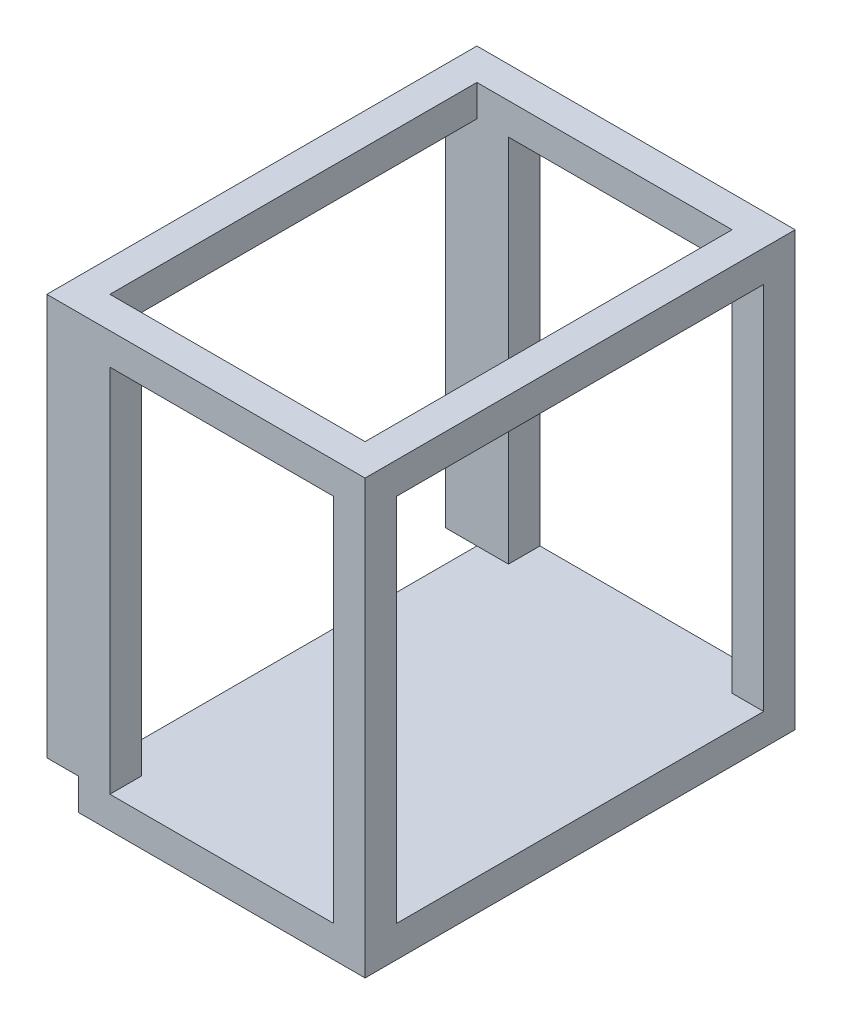
ISO-10303-21;
HEADER;
FILE_DESCRIPTION(('STEP AP214'),'2;1');
FILE_NAME('part.step','',(''),(''),'','','');
FILE_SCHEMA(('AUTOMOTIVE_DESIGN { 1 0 10303 214 1 1 1 1 }'));
ENDSEC;
DATA;
#1=APPLICATION_CONTEXT('core data for automotive mechanical design processes');
#2=APPLICATION_PROTOCOL_DEFINITION('international standard','automotive_design',2000,#1);
#3=PRODUCT_CONTEXT('',#1,'mechanical');
#4=PRODUCT('Part','Part','',(#3));
#5=PRODUCT_RELATED_PRODUCT_CATEGORY('part','',(#4));
#6=PRODUCT_DEFINITION_FORMATION('','',#4);
#7=PRODUCT_DEFINITION_CONTEXT('part definition',#1,'design');
#8=PRODUCT_DEFINITION('design','',#6,#7);
#9=PRODUCT_DEFINITION_SHAPE('','',#8);
#10=(LENGTH_UNIT() NAMED_UNIT(*) SI_UNIT(.MILLI.,.METRE.));
#11=(NAMED_UNIT(*) PLANE_ANGLE_UNIT() SI_UNIT($,.RADIAN.));
#12=(NAMED_UNIT(*) SI_UNIT($,.STERADIAN.) SOLID_ANGLE_UNIT());
#13=UNCERTAINTY_MEASURE_WITH_UNIT(LENGTH_MEASURE(1.E-05),#10,'distance_accuracy_value','');
#14=(GEOMETRIC_REPRESENTATION_CONTEXT(3) GLOBAL_UNCERTAINTY_ASSIGNED_CONTEXT((#13)) GLOBAL_UNIT_ASSIGNED_CONTEXT((#10,
#11,#12)) REPRESENTATION_CONTEXT('',''));
#15=CARTESIAN_POINT('',(0.,0.,0.));
#16=DIRECTION('',(0.,0.,1.));
#17=DIRECTION('',(1.,0.,0.));
#18=AXIS2_PLACEMENT_3D('',#15,#16,#17);
#19=CARTESIAN_POINT('',(-100.,-0.01,-150.01));
#20=DIRECTION('',(-1.,0.,0.));
#21=DIRECTION('',(0.,0.,1.));
#22=AXIS2_PLACEMENT_3D('',#19,#20,#21);
#23=PLANE('',#22);
#24=DIRECTION('',(0.,0.,1.));
#25=VECTOR('',#24,1.);
#26=CARTESIAN_POINT('',(-99.9999999999999,22.,-139.));
#27=LINE('',#26,#25);
#28=CARTESIAN_POINT('',(-100.,22.,-150.));
#29=VERTEX_POINT('',#28);
#30=CARTESIAN_POINT('',(-100.,22.,-128.));
#31=VERTEX_POINT('',#30);
#32=EDGE_CURVE('E163',#29,#31,#27,.T.);
#33=ORIENTED_EDGE('',*,*,#32,.F.);
#34=DIRECTION('',(0.,1.,0.));
#35=VECTOR('',#34,1.);
#36=CARTESIAN_POINT('',(-100.,151.,-150.));
#37=LINE('',#36,#35);
#38=CARTESIAN_POINT('',(-100.,0.,-150.));
#39=VERTEX_POINT('',#38);
#40=EDGE_CURVE('E189',#39,#29,#37,.T.);
#41=ORIENTED_EDGE('',*,*,#40,.F.);
#42=DIRECTION('',(0.,0.,-1.));
#43=VECTOR('',#42,1.);
#44=CARTESIAN_POINT('',(-100.,0.,0.));
#45=LINE('',#44,#43);
#46=CARTESIAN_POINT('',(-100.,0.,150.));
#47=VERTEX_POINT('',#46);
#48=EDGE_CURVE('E229',#47,#39,#45,.T.);
#49=ORIENTED_EDGE('',*,*,#48,.F.);
#50=DIRECTION('',(0.,-1.,0.));
#51=VECTOR('',#50,1.);
#52=CARTESIAN_POINT('',(-100.,151.,150.));
#53=LINE('',#52,#51);
#54=CARTESIAN_POINT('',(-100.,22.,150.));
#55=VERTEX_POINT('',#54);
#56=EDGE_CURVE('E227',#55,#47,#53,.T.);
#57=ORIENTED_EDGE('',*,*,#56,.F.);
#58=DIRECTION('',(0.,0.,1.));
#59=VECTOR('',#58,1.);
#60=CARTESIAN_POINT('',(-100.,22.,139.));
#61=LINE('',#60,#59);
#62=CARTESIAN_POINT('',(-100.,22.,128.));
#63=VERTEX_POINT('',#62);
#64=EDGE_CURVE('E21',#63,#55,#61,.T.);
#65=ORIENTED_EDGE('',*,*,#64,.F.);
#66=DIRECTION('',(0.,0.,1.));
#67=VECTOR('',#66,1.);
#68=CARTESIAN_POINT('',(-100.,22.,0.));
#69=LINE('',#68,#67);
#70=EDGE_CURVE('E273',#31,#63,#69,.T.);
#71=ORIENTED_EDGE('',*,*,#70,.F.);
#72=EDGE_LOOP('',(#33,#41,#49,#57,#65,#71));
#73=FACE_BOUND('',#72,.T.);
#74=ADVANCED_FACE('F17',(#73),#23,.T.);
#75=CARTESIAN_POINT('',(-122.01,22.,150.01));
#76=DIRECTION('',(0.,-1.,0.));
#77=DIRECTION('',(0.,0.,-1.));
#78=AXIS2_PLACEMENT_3D('',#75,#76,#77);
#79=PLANE('',#78);
#80=DIRECTION('',(0.,0.,1.));
#81=VECTOR('',#80,1.);
#82=CARTESIAN_POINT('',(-122.,22.,0.));
#83=LINE('',#82,#81);
#84=CARTESIAN_POINT('',(-122.,22.,128.));
#85=VERTEX_POINT('',#84);
#86=CARTESIAN_POINT('',(-122.,22.,150.));
#87=VERTEX_POINT('',#86);
#88=EDGE_CURVE('E202',#85,#87,#83,.T.);
#89=ORIENTED_EDGE('',*,*,#88,.F.);
#90=DIRECTION('',(-1.,0.,0.));
#91=VECTOR('',#90,1.);
#92=CARTESIAN_POINT('',(-22.,22.,128.));
#93=LINE('',#92,#91);
#94=EDGE_CURVE('E223',#63,#85,#93,.T.);
#95=ORIENTED_EDGE('',*,*,#94,.F.);
#96=ORIENTED_EDGE('',*,*,#64,.T.);
#97=DIRECTION('',(1.,0.,0.));
#98=VECTOR('',#97,1.);
#99=CARTESIAN_POINT('',(-11.,22.,150.));
#100=LINE('',#99,#98);
#101=EDGE_CURVE('E220',#87,#55,#100,.T.);
#102=ORIENTED_EDGE('',*,*,#101,.F.);
#103=EDGE_LOOP('',(#89,#95,#96,#102));
#104=FACE_BOUND('',#103,.T.);
#105=ADVANCED_FACE('F218',(#104),#79,.T.);
#106=CARTESIAN_POINT('',(-78.01,280.,150.01));
#107=DIRECTION('',(0.,-1.,0.));
#108=DIRECTION('',(0.,0.,-1.));
#109=AXIS2_PLACEMENT_3D('',#106,#107,#108);
#110=PLANE('',#109);
#111=DIRECTION('',(0.,0.,-1.));
#112=VECTOR('',#111,1.);
#113=CARTESIAN_POINT('',(78.,280.,139.));
#114=LINE('',#113,#112);
#115=CARTESIAN_POINT('',(78.,280.,150.));
#116=VERTEX_POINT('',#115);
#117=CARTESIAN_POINT('',(78.,280.,128.));
#118=VERTEX_POINT('',#117);
#119=EDGE_CURVE('E294',#116,#118,#114,.T.);
#120=ORIENTED_EDGE('',*,*,#119,.F.);
#121=DIRECTION('',(1.,0.,0.));
#122=VECTOR('',#121,1.);
#123=CARTESIAN_POINT('',(-11.,280.,150.));
#124=LINE('',#123,#122);
#125=CARTESIAN_POINT('',(-78.,280.,150.));
#126=VERTEX_POINT('',#125);
#127=EDGE_CURVE('E232',#126,#116,#124,.T.);
#128=ORIENTED_EDGE('',*,*,#127,.F.);
#129=DIRECTION('',(0.,0.,1.));
#130=VECTOR('',#129,1.);
#131=CARTESIAN_POINT('',(-78.,280.,139.));
#132=LINE('',#131,#130);
#133=CARTESIAN_POINT('',(-78.,280.,128.));
#134=VERTEX_POINT('',#133);
#135=EDGE_CURVE('E209',#134,#126,#132,.T.);
#136=ORIENTED_EDGE('',*,*,#135,.F.);
#137=DIRECTION('',(-1.,0.,0.));
#138=VECTOR('',#137,1.);
#139=CARTESIAN_POINT('',(-22.,280.,128.));
#140=LINE('',#139,#138);
#141=EDGE_CURVE('E36',#118,#134,#140,.T.);
#142=ORIENTED_EDGE('',*,*,#141,.F.);
#143=EDGE_LOOP('',(#120,#128,#136,#142));
#144=FACE_BOUND('',#143,.T.);
#145=ADVANCED_FACE('F295',(#144),#110,.T.);
#146=CARTESIAN_POINT('',(-78.,21.99,150.01));
#147=DIRECTION('',(1.,0.,0.));
#148=DIRECTION('',(0.,0.,-1.));
#149=AXIS2_PLACEMENT_3D('',#146,#147,#148);
#150=PLANE('',#149);
#151=ORIENTED_EDGE('',*,*,#135,.T.);
#152=DIRECTION('',(0.,1.,0.));
#153=VECTOR('',#152,1.);
#154=CARTESIAN_POINT('',(-78.,151.,150.));
#155=LINE('',#154,#153);
#156=CARTESIAN_POINT('',(-78.,22.,150.));
#157=VERTEX_POINT('',#156);
#158=EDGE_CURVE('E287',#157,#126,#155,.T.);
#159=ORIENTED_EDGE('',*,*,#158,.F.);
#160=DIRECTION('',(0.,0.,1.));
#161=VECTOR('',#160,1.);
#162=CARTESIAN_POINT('',(-78.,22.,0.));
#163=LINE('',#162,#161);
#164=CARTESIAN_POINT('',(-78.,22.,128.));
#165=VERTEX_POINT('',#164);
#166=EDGE_CURVE('E309',#165,#157,#163,.T.);
#167=ORIENTED_EDGE('',*,*,#166,.F.);
#168=DIRECTION('',(0.,-1.,0.));
#169=VECTOR('',#168,1.);
#170=CARTESIAN_POINT('',(-78.,162.,128.));
#171=LINE('',#170,#169);
#172=EDGE_CURVE('E332',#134,#165,#171,.T.);
#173=ORIENTED_EDGE('',*,*,#172,.F.);
#174=EDGE_LOOP('',(#151,#159,#167,#173));
#175=FACE_BOUND('',#174,.T.);
#176=ADVANCED_FACE('F346',(#175),#150,.T.);
#177=CARTESIAN_POINT('',(-122.01,22.,-127.99));
#178=DIRECTION('',(0.,-1.,0.));
#179=DIRECTION('',(0.,0.,-1.));
#180=AXIS2_PLACEMENT_3D('',#177,#178,#179);
#181=PLANE('',#180);
#182=DIRECTION('',(0.,0.,1.));
#183=VECTOR('',#182,1.);
#184=CARTESIAN_POINT('',(-122.,22.,0.));
#185=LINE('',#184,#183);
#186=CARTESIAN_POINT('',(-122.,22.,-150.));
#187=VERTEX_POINT('',#186);
#188=CARTESIAN_POINT('',(-122.,22.,-128.));
#189=VERTEX_POINT('',#188);
#190=EDGE_CURVE('E168',#187,#189,#185,.T.);
#191=ORIENTED_EDGE('',*,*,#190,.F.);
#192=DIRECTION('',(-1.,0.,0.));
#193=VECTOR('',#192,1.);
#194=CARTESIAN_POINT('',(-11.,22.,-150.));
#195=LINE('',#194,#193);
#196=EDGE_CURVE('E172',#29,#187,#195,.T.);
#197=ORIENTED_EDGE('',*,*,#196,.F.);
#198=ORIENTED_EDGE('',*,*,#32,.T.);
#199=DIRECTION('',(1.,0.,0.));
#200=VECTOR('',#199,1.);
#201=CARTESIAN_POINT('',(-22.,22.,-128.));
#202=LINE('',#201,#200);
#203=EDGE_CURVE('E175',#189,#31,#202,.T.);
#204=ORIENTED_EDGE('',*,*,#203,.F.);
#205=EDGE_LOOP('',(#191,#197,#198,#204));
#206=FACE_BOUND('',#205,.T.);
#207=ADVANCED_FACE('F170',(#206),#181,.T.);
#208=CARTESIAN_POINT('',(-78.,21.99,-127.99));
#209=DIRECTION('',(1.,0.,0.));
#210=DIRECTION('',(0.,0.,-1.));
#211=AXIS2_PLACEMENT_3D('',#208,#209,#210);
#212=PLANE('',#211);
#213=DIRECTION('',(0.,0.,-1.));
#214=VECTOR('',#213,1.);
#215=CARTESIAN_POINT('',(-78.,280.,-139.));
#216=LINE('',#215,#214);
#217=CARTESIAN_POINT('',(-78.,280.,-128.));
#218=VERTEX_POINT('',#217);
#219=CARTESIAN_POINT('',(-78.,280.,-150.));
#220=VERTEX_POINT('',#219);
#221=EDGE_CURVE('E206',#218,#220,#216,.T.);
#222=ORIENTED_EDGE('',*,*,#221,.F.);
#223=DIRECTION('',(0.,1.,0.));
#224=VECTOR('',#223,1.);
#225=CARTESIAN_POINT('',(-78.,162.,-128.));
#226=LINE('',#225,#224);
#227=CARTESIAN_POINT('',(-78.,22.,-128.));
#228=VERTEX_POINT('',#227);
#229=EDGE_CURVE('E268',#228,#218,#226,.T.);
#230=ORIENTED_EDGE('',*,*,#229,.F.);
#231=DIRECTION('',(0.,0.,1.));
#232=VECTOR('',#231,1.);
#233=CARTESIAN_POINT('',(-78.,22.,0.));
#234=LINE('',#233,#232);
#235=CARTESIAN_POINT('',(-78.,22.,-150.));
#236=VERTEX_POINT('',#235);
#237=EDGE_CURVE('E270',#236,#228,#234,.T.);
#238=ORIENTED_EDGE('',*,*,#237,.F.);
#239=DIRECTION('',(0.,-1.,0.));
#240=VECTOR('',#239,1.);
#241=CARTESIAN_POINT('',(-78.,151.,-150.));
#242=LINE('',#241,#240);
#243=EDGE_CURVE('E194',#220,#236,#242,.T.);
#244=ORIENTED_EDGE('',*,*,#243,.F.);
#245=EDGE_LOOP('',(#222,#230,#238,#244));
#246=FACE_BOUND('',#245,.T.);
#247=ADVANCED_FACE('F266',(#246),#212,.T.);
#248=CARTESIAN_POINT('',(-78.01,280.,-127.99));
#249=DIRECTION('',(0.,-1.,0.));
#250=DIRECTION('',(0.,0.,-1.));
#251=AXIS2_PLACEMENT_3D('',#248,#249,#250);
#252=PLANE('',#251);
#253=DIRECTION('',(0.,0.,-1.));
#254=VECTOR('',#253,1.);
#255=CARTESIAN_POINT('',(78.,280.,-139.));
#256=LINE('',#255,#254);
#257=CARTESIAN_POINT('',(78.,280.,-128.));
#258=VERTEX_POINT('',#257);
#259=CARTESIAN_POINT('',(78.,280.,-150.));
#260=VERTEX_POINT('',#259);
#261=EDGE_CURVE('E190',#258,#260,#256,.T.);
#262=ORIENTED_EDGE('',*,*,#261,.F.);
#263=DIRECTION('',(1.,0.,0.));
#264=VECTOR('',#263,1.);
#265=CARTESIAN_POINT('',(-22.,280.,-128.));
#266=LINE('',#265,#264);
#267=EDGE_CURVE('E262',#218,#258,#266,.T.);
#268=ORIENTED_EDGE('',*,*,#267,.F.);
#269=ORIENTED_EDGE('',*,*,#221,.T.);
#270=DIRECTION('',(-1.,0.,0.));
#271=VECTOR('',#270,1.);
#272=CARTESIAN_POINT('',(-11.,280.,-150.));
#273=LINE('',#272,#271);
#274=EDGE_CURVE('E239',#260,#220,#273,.T.);
#275=ORIENTED_EDGE('',*,*,#274,.F.);
#276=EDGE_LOOP('',(#262,#268,#269,#275));
#277=FACE_BOUND('',#276,.T.);
#278=ADVANCED_FACE('F261',(#277),#252,.T.);
#279=CARTESIAN_POINT('',(-100.,279.99,128.01));
#280=DIRECTION('',(1.,0.,0.));
#281=DIRECTION('',(0.,0.,-1.));
#282=AXIS2_PLACEMENT_3D('',#279,#280,#281);
#283=PLANE('',#282);
#284=DIRECTION('',(0.,0.,-1.));
#285=VECTOR('',#284,1.);
#286=CARTESIAN_POINT('',(-100.,302.,0.));
#287=LINE('',#286,#285);
#288=CARTESIAN_POINT('',(-100.,302.,128.));
#289=VERTEX_POINT('',#288);
#290=CARTESIAN_POINT('',(-100.,302.,-128.));
#291=VERTEX_POINT('',#290);
#292=EDGE_CURVE('E322',#289,#291,#287,.T.);
#293=ORIENTED_EDGE('',*,*,#292,.F.);
#294=DIRECTION('',(0.,1.,0.));
#295=VECTOR('',#294,1.);
#296=CARTESIAN_POINT('',(-100.,162.,128.));
#297=LINE('',#296,#295);
#298=CARTESIAN_POINT('',(-100.,280.,128.));
#299=VERTEX_POINT('',#298);
#300=EDGE_CURVE('E335',#299,#289,#297,.T.);
#301=ORIENTED_EDGE('',*,*,#300,.F.);
#302=DIRECTION('',(0.,0.,1.));
#303=VECTOR('',#302,1.);
#304=CARTESIAN_POINT('',(-100.,280.,0.));
#305=LINE('',#304,#303);
#306=CARTESIAN_POINT('',(-100.,280.,-128.));
#307=VERTEX_POINT('',#306);
#308=EDGE_CURVE('E180',#307,#299,#305,.T.);
#309=ORIENTED_EDGE('',*,*,#308,.F.);
#310=DIRECTION('',(0.,-1.,0.));
#311=VECTOR('',#310,1.);
#312=CARTESIAN_POINT('',(-100.,162.,-128.));
#313=LINE('',#312,#311);
#314=EDGE_CURVE('E385',#291,#307,#313,.T.);
#315=ORIENTED_EDGE('',*,*,#314,.F.);
#316=EDGE_LOOP('',(#293,#301,#309,#315));
#317=FACE_BOUND('',#316,.T.);
#318=ADVANCED_FACE('F424',(#317),#283,.T.);
#319=CARTESIAN_POINT('',(-122.01,280.,128.01));
#320=DIRECTION('',(0.,-1.,0.));
#321=DIRECTION('',(0.,0.,-1.));
#322=AXIS2_PLACEMENT_3D('',#319,#320,#321);
#323=PLANE('',#322);
#324=DIRECTION('',(1.,0.,0.));
#325=VECTOR('',#324,1.);
#326=CARTESIAN_POINT('',(-22.,280.,128.));
#327=LINE('',#326,#325);
#328=CARTESIAN_POINT('',(-122.,280.,128.));
#329=VERTEX_POINT('',#328);
#330=EDGE_CURVE('E338',#329,#299,#327,.T.);
#331=ORIENTED_EDGE('',*,*,#330,.F.);
#332=DIRECTION('',(0.,0.,1.));
#333=VECTOR('',#332,1.);
#334=CARTESIAN_POINT('',(-122.,280.,0.));
#335=LINE('',#334,#333);
#336=CARTESIAN_POINT('',(-122.,280.,-128.));
#337=VERTEX_POINT('',#336);
#338=EDGE_CURVE('E179',#337,#329,#335,.T.);
#339=ORIENTED_EDGE('',*,*,#338,.F.);
#340=DIRECTION('',(-1.,0.,0.));
#341=VECTOR('',#340,1.);
#342=CARTESIAN_POINT('',(-22.,280.,-128.));
#343=LINE('',#342,#341);
#344=EDGE_CURVE('E383',#307,#337,#343,.T.);
#345=ORIENTED_EDGE('',*,*,#344,.F.);
#346=ORIENTED_EDGE('',*,*,#308,.T.);
#347=EDGE_LOOP('',(#331,#339,#345,#346));
#348=FACE_BOUND('',#347,.T.);
#349=ADVANCED_FACE('F427',(#348),#323,.T.);
#350=CARTESIAN_POINT('',(-122.,21.99,-150.01));
#351=DIRECTION('',(-1.,0.,0.));
#352=DIRECTION('',(0.,0.,1.));
#353=AXIS2_PLACEMENT_3D('',#350,#351,#352);
#354=PLANE('',#353);
#355=DIRECTION('',(0.,0.,1.));
#356=VECTOR('',#355,1.);
#357=CARTESIAN_POINT('',(-122.,302.,0.));
#358=LINE('',#357,#356);
#359=CARTESIAN_POINT('',(-122.,302.,-150.));
#360=VERTEX_POINT('',#359);
#361=CARTESIAN_POINT('',(-122.,302.,150.));
#362=VERTEX_POINT('',#361);
#363=EDGE_CURVE('E186',#360,#362,#358,.T.);
#364=ORIENTED_EDGE('',*,*,#363,.F.);
#365=DIRECTION('',(0.,1.,0.));
#366=VECTOR('',#365,1.);
#367=CARTESIAN_POINT('',(-122.,151.,-150.));
#368=LINE('',#367,#366);
#369=EDGE_CURVE('E183',#187,#360,#368,.T.);
#370=ORIENTED_EDGE('',*,*,#369,.F.);
#371=ORIENTED_EDGE('',*,*,#190,.T.);
#372=DIRECTION('',(0.,-1.,0.));
#373=VECTOR('',#372,1.);
#374=CARTESIAN_POINT('',(-122.,162.,-128.));
#375=LINE('',#374,#373);
#376=EDGE_CURVE('E318',#337,#189,#375,.T.);
#377=ORIENTED_EDGE('',*,*,#376,.F.);
#378=ORIENTED_EDGE('',*,*,#338,.T.);
#379=DIRECTION('',(0.,1.,0.));
#380=VECTOR('',#379,1.);
#381=CARTESIAN_POINT('',(-122.,162.,128.));
#382=LINE('',#381,#380);
#383=EDGE_CURVE('E341',#85,#329,#382,.T.);
#384=ORIENTED_EDGE('',*,*,#383,.F.);
#385=ORIENTED_EDGE('',*,*,#88,.T.);
#386=DIRECTION('',(0.,-1.,0.));
#387=VECTOR('',#386,1.);
#388=CARTESIAN_POINT('',(-122.,151.,150.));
#389=LINE('',#388,#387);
#390=EDGE_CURVE('E237',#362,#87,#389,.T.);
#391=ORIENTED_EDGE('',*,*,#390,.F.);
#392=EDGE_LOOP('',(#364,#370,#371,#377,#378,#384,#385,#391));
#393=FACE_BOUND('',#392,.T.);
#394=ADVANCED_FACE('F184',(#393),#354,.T.);
#395=CARTESIAN_POINT('',(78.,21.99,-150.01));
#396=DIRECTION('',(-1.,0.,0.));
#397=DIRECTION('',(0.,0.,1.));
#398=AXIS2_PLACEMENT_3D('',#395,#396,#397);
#399=PLANE('',#398);
#400=ORIENTED_EDGE('',*,*,#261,.T.);
#401=DIRECTION('',(0.,1.,0.));
#402=VECTOR('',#401,1.);
#403=CARTESIAN_POINT('',(78.,151.,-150.));
#404=LINE('',#403,#402);
#405=CARTESIAN_POINT('',(78.,22.,-150.));
#406=VERTEX_POINT('',#405);
#407=EDGE_CURVE('E196',#406,#260,#404,.T.);
#408=ORIENTED_EDGE('',*,*,#407,.F.);
#409=DIRECTION('',(0.,0.,-1.));
#410=VECTOR('',#409,1.);
#411=CARTESIAN_POINT('',(78.,22.,0.));
#412=LINE('',#411,#410);
#413=CARTESIAN_POINT('',(78.,22.,-128.));
#414=VERTEX_POINT('',#413);
#415=EDGE_CURVE('E254',#414,#406,#412,.T.);
#416=ORIENTED_EDGE('',*,*,#415,.F.);
#417=DIRECTION('',(0.,-1.,0.));
#418=VECTOR('',#417,1.);
#419=CARTESIAN_POINT('',(78.,151.,-128.));
#420=LINE('',#419,#418);
#421=EDGE_CURVE('E257',#258,#414,#420,.T.);
#422=ORIENTED_EDGE('',*,*,#421,.F.);
#423=EDGE_LOOP('',(#400,#408,#416,#422));
#424=FACE_BOUND('',#423,.T.);
#425=ADVANCED_FACE('F252',(#424),#399,.T.);
#426=CARTESIAN_POINT('',(100.01,-0.01,-150.));
#427=DIRECTION('',(0.,0.,-1.));
#428=DIRECTION('',(-1.,0.,0.));
#429=AXIS2_PLACEMENT_3D('',#426,#427,#428);
#430=PLANE('',#429);
#431=ORIENTED_EDGE('',*,*,#407,.T.);
#432=ORIENTED_EDGE('',*,*,#274,.T.);
#433=ORIENTED_EDGE('',*,*,#243,.T.);
#434=DIRECTION('',(-1.,0.,0.));
#435=VECTOR('',#434,1.);
#436=CARTESIAN_POINT('',(0.,22.,-150.));
#437=LINE('',#436,#435);
#438=EDGE_CURVE('E249',#406,#236,#437,.T.);
#439=ORIENTED_EDGE('',*,*,#438,.F.);
#440=EDGE_LOOP('',(#431,#432,#433,#439));
#441=FACE_BOUND('',#440,.T.);
#442=ORIENTED_EDGE('',*,*,#40,.T.);
#443=ORIENTED_EDGE('',*,*,#196,.T.);
#444=ORIENTED_EDGE('',*,*,#369,.T.);
#445=DIRECTION('',(-1.,0.,0.));
#446=VECTOR('',#445,1.);
#447=CARTESIAN_POINT('',(-11.,302.,-150.));
#448=LINE('',#447,#446);
#449=CARTESIAN_POINT('',(100.,302.,-150.));
#450=VERTEX_POINT('',#449);
#451=EDGE_CURVE('E328',#450,#360,#448,.T.);
#452=ORIENTED_EDGE('',*,*,#451,.F.);
#453=DIRECTION('',(0.,1.,0.));
#454=VECTOR('',#453,1.);
#455=CARTESIAN_POINT('',(100.,151.,-150.));
#456=LINE('',#455,#454);
#457=CARTESIAN_POINT('',(100.,0.,-150.));
#458=VERTEX_POINT('',#457);
#459=EDGE_CURVE('E376',#458,#450,#456,.T.);
#460=ORIENTED_EDGE('',*,*,#459,.F.);
#461=DIRECTION('',(1.,0.,0.));
#462=VECTOR('',#461,1.);
#463=CARTESIAN_POINT('',(0.,0.,-150.));
#464=LINE('',#463,#462);
#465=EDGE_CURVE('E278',#39,#458,#464,.T.);
#466=ORIENTED_EDGE('',*,*,#465,.F.);
#467=EDGE_LOOP('',(#442,#443,#444,#452,#460,#466));
#468=FACE_BOUND('',#467,.T.);
#469=ADVANCED_FACE('F192',(#441,#468),#430,.T.);
#470=CARTESIAN_POINT('',(-122.01,-0.01,150.));
#471=DIRECTION('',(0.,0.,1.));
#472=DIRECTION('',(1.,0.,0.));
#473=AXIS2_PLACEMENT_3D('',#470,#471,#472);
#474=PLANE('',#473);
#475=DIRECTION('',(1.,0.,0.));
#476=VECTOR('',#475,1.);
#477=CARTESIAN_POINT('',(0.,22.,150.));
#478=LINE('',#477,#476);
#479=CARTESIAN_POINT('',(78.,22.,150.));
#480=VERTEX_POINT('',#479);
#481=EDGE_CURVE('E304',#157,#480,#478,.T.);
#482=ORIENTED_EDGE('',*,*,#481,.F.);
#483=ORIENTED_EDGE('',*,*,#158,.T.);
#484=ORIENTED_EDGE('',*,*,#127,.T.);
#485=DIRECTION('',(0.,1.,0.));
#486=VECTOR('',#485,1.);
#487=CARTESIAN_POINT('',(78.,151.,150.));
#488=LINE('',#487,#486);
#489=EDGE_CURVE('E292',#480,#116,#488,.T.);
#490=ORIENTED_EDGE('',*,*,#489,.F.);
#491=EDGE_LOOP('',(#482,#483,#484,#490));
#492=FACE_BOUND('',#491,.T.);
#493=DIRECTION('',(0.,-1.,0.));
#494=VECTOR('',#493,1.);
#495=CARTESIAN_POINT('',(100.,151.,150.));
#496=LINE('',#495,#494);
#497=CARTESIAN_POINT('',(100.,302.,150.));
#498=VERTEX_POINT('',#497);
#499=CARTESIAN_POINT('',(100.,0.,150.));
#500=VERTEX_POINT('',#499);
#501=EDGE_CURVE('E370',#498,#500,#496,.T.);
#502=ORIENTED_EDGE('',*,*,#501,.F.);
#503=DIRECTION('',(1.,0.,0.));
#504=VECTOR('',#503,1.);
#505=CARTESIAN_POINT('',(-11.,302.,150.));
#506=LINE('',#505,#504);
#507=EDGE_CURVE('E330',#362,#498,#506,.T.);
#508=ORIENTED_EDGE('',*,*,#507,.F.);
#509=ORIENTED_EDGE('',*,*,#390,.T.);
#510=ORIENTED_EDGE('',*,*,#101,.T.);
#511=ORIENTED_EDGE('',*,*,#56,.T.);
#512=DIRECTION('',(-1.,0.,0.));
#513=VECTOR('',#512,1.);
#514=CARTESIAN_POINT('',(0.,0.,150.));
#515=LINE('',#514,#513);
#516=EDGE_CURVE('E285',#500,#47,#515,.T.);
#517=ORIENTED_EDGE('',*,*,#516,.F.);
#518=EDGE_LOOP('',(#502,#508,#509,#510,#511,#517));
#519=FACE_BOUND('',#518,.T.);
#520=ADVANCED_FACE('F235',(#492,#519),#474,.T.);
#521=CARTESIAN_POINT('',(-100.01,0.,150.01));
#522=DIRECTION('',(0.,-1.,0.));
#523=DIRECTION('',(0.,0.,-1.));
#524=AXIS2_PLACEMENT_3D('',#521,#522,#523);
#525=PLANE('',#524);
#526=ORIENTED_EDGE('',*,*,#465,.T.);
#527=DIRECTION('',(0.,0.,-1.));
#528=VECTOR('',#527,1.);
#529=CARTESIAN_POINT('',(100.,0.,0.));
#530=LINE('',#529,#528);
#531=EDGE_CURVE('E367',#500,#458,#530,.T.);
#532=ORIENTED_EDGE('',*,*,#531,.F.);
#533=ORIENTED_EDGE('',*,*,#516,.T.);
#534=ORIENTED_EDGE('',*,*,#48,.T.);
#535=EDGE_LOOP('',(#526,#532,#533,#534));
#536=FACE_BOUND('',#535,.T.);
#537=ADVANCED_FACE('F433',(#536),#525,.T.);
#538=CARTESIAN_POINT('',(-100.01,22.,-150.01));
#539=DIRECTION('',(0.,1.,0.));
#540=DIRECTION('',(0.,0.,1.));
#541=AXIS2_PLACEMENT_3D('',#538,#539,#540);
#542=PLANE('',#541);
#543=DIRECTION('',(0.,0.,1.));
#544=VECTOR('',#543,1.);
#545=CARTESIAN_POINT('',(100.,22.,0.));
#546=LINE('',#545,#544);
#547=CARTESIAN_POINT('',(100.,22.,-128.));
#548=VERTEX_POINT('',#547);
#549=CARTESIAN_POINT('',(100.,22.,128.));
#550=VERTEX_POINT('',#549);
#551=EDGE_CURVE('E359',#548,#550,#546,.T.);
#552=ORIENTED_EDGE('',*,*,#551,.F.);
#553=DIRECTION('',(1.,0.,0.));
#554=VECTOR('',#553,1.);
#555=CARTESIAN_POINT('',(89.,22.,-128.));
#556=LINE('',#555,#554);
#557=EDGE_CURVE('E380',#414,#548,#556,.T.);
#558=ORIENTED_EDGE('',*,*,#557,.F.);
#559=ORIENTED_EDGE('',*,*,#415,.T.);
#560=ORIENTED_EDGE('',*,*,#438,.T.);
#561=ORIENTED_EDGE('',*,*,#237,.T.);
#562=DIRECTION('',(1.,0.,0.));
#563=VECTOR('',#562,1.);
#564=CARTESIAN_POINT('',(-22.,22.,-128.));
#565=LINE('',#564,#563);
#566=EDGE_CURVE('E313',#31,#228,#565,.T.);
#567=ORIENTED_EDGE('',*,*,#566,.F.);
#568=ORIENTED_EDGE('',*,*,#70,.T.);
#569=DIRECTION('',(-1.,0.,0.));
#570=VECTOR('',#569,1.);
#571=CARTESIAN_POINT('',(-22.,22.,128.));
#572=LINE('',#571,#570);
#573=EDGE_CURVE('E299',#165,#63,#572,.T.);
#574=ORIENTED_EDGE('',*,*,#573,.F.);
#575=ORIENTED_EDGE('',*,*,#166,.T.);
#576=ORIENTED_EDGE('',*,*,#481,.T.);
#577=DIRECTION('',(0.,0.,1.));
#578=VECTOR('',#577,1.);
#579=CARTESIAN_POINT('',(78.,22.,139.));
#580=LINE('',#579,#578);
#581=CARTESIAN_POINT('',(78.,22.,128.));
#582=VERTEX_POINT('',#581);
#583=EDGE_CURVE('E302',#582,#480,#580,.T.);
#584=ORIENTED_EDGE('',*,*,#583,.F.);
#585=DIRECTION('',(-1.,0.,0.));
#586=VECTOR('',#585,1.);
#587=CARTESIAN_POINT('',(89.,22.,128.));
#588=LINE('',#587,#586);
#589=EDGE_CURVE('E348',#550,#582,#588,.T.);
#590=ORIENTED_EDGE('',*,*,#589,.F.);
#591=EDGE_LOOP('',(#552,#558,#559,#560,#561,#567,#568,#574,#575,#576,#584,#590));
#592=FACE_BOUND('',#591,.T.);
#593=ADVANCED_FACE('F276',(#592),#542,.T.);
#594=CARTESIAN_POINT('',(78.,21.99,127.99));
#595=DIRECTION('',(-1.,0.,0.));
#596=DIRECTION('',(0.,0.,1.));
#597=AXIS2_PLACEMENT_3D('',#594,#595,#596);
#598=PLANE('',#597);
#599=ORIENTED_EDGE('',*,*,#119,.T.);
#600=DIRECTION('',(0.,1.,0.));
#601=VECTOR('',#600,1.);
#602=CARTESIAN_POINT('',(78.,151.,128.));
#603=LINE('',#602,#601);
#604=EDGE_CURVE('E351',#582,#118,#603,.T.);
#605=ORIENTED_EDGE('',*,*,#604,.F.);
#606=ORIENTED_EDGE('',*,*,#583,.T.);
#607=ORIENTED_EDGE('',*,*,#489,.T.);
#608=EDGE_LOOP('',(#599,#605,#606,#607));
#609=FACE_BOUND('',#608,.T.);
#610=ADVANCED_FACE('F301',(#609),#598,.T.);
#611=CARTESIAN_POINT('',(78.01,21.99,128.));
#612=DIRECTION('',(0.,0.,-1.));
#613=DIRECTION('',(-1.,0.,0.));
#614=AXIS2_PLACEMENT_3D('',#611,#612,#613);
#615=PLANE('',#614);
#616=ORIENTED_EDGE('',*,*,#141,.T.);
#617=ORIENTED_EDGE('',*,*,#172,.T.);
#618=ORIENTED_EDGE('',*,*,#573,.T.);
#619=ORIENTED_EDGE('',*,*,#94,.T.);
#620=ORIENTED_EDGE('',*,*,#383,.T.);
#621=ORIENTED_EDGE('',*,*,#330,.T.);
#622=ORIENTED_EDGE('',*,*,#300,.T.);
#623=DIRECTION('',(-1.,0.,0.));
#624=VECTOR('',#623,1.);
#625=CARTESIAN_POINT('',(-11.,302.,128.));
#626=LINE('',#625,#624);
#627=CARTESIAN_POINT('',(78.,302.,128.));
#628=VERTEX_POINT('',#627);
#629=EDGE_CURVE('E319',#628,#289,#626,.T.);
#630=ORIENTED_EDGE('',*,*,#629,.F.);
#631=DIRECTION('',(0.,1.,0.));
#632=VECTOR('',#631,1.);
#633=CARTESIAN_POINT('',(78.,291.,128.));
#634=LINE('',#633,#632);
#635=EDGE_CURVE('E416',#118,#628,#634,.T.);
#636=ORIENTED_EDGE('',*,*,#635,.F.);
#637=EDGE_LOOP('',(#616,#617,#618,#619,#620,#621,#622,#630,#636));
#638=FACE_BOUND('',#637,.T.);
#639=ADVANCED_FACE('F345',(#638),#615,.T.);
#640=CARTESIAN_POINT('',(-122.01,302.,-150.01));
#641=DIRECTION('',(0.,1.,0.));
#642=DIRECTION('',(0.,0.,1.));
#643=AXIS2_PLACEMENT_3D('',#640,#641,#642);
#644=PLANE('',#643);
#645=DIRECTION('',(0.,0.,-1.));
#646=VECTOR('',#645,1.);
#647=CARTESIAN_POINT('',(78.,302.,0.));
#648=LINE('',#647,#646);
#649=CARTESIAN_POINT('',(77.9999999999999,302.,-128.));
#650=VERTEX_POINT('',#649);
#651=EDGE_CURVE('E410',#628,#650,#648,.T.);
#652=ORIENTED_EDGE('',*,*,#651,.F.);
#653=ORIENTED_EDGE('',*,*,#629,.T.);
#654=ORIENTED_EDGE('',*,*,#292,.T.);
#655=DIRECTION('',(-1.,0.,0.));
#656=VECTOR('',#655,1.);
#657=CARTESIAN_POINT('',(-22.,302.,-128.));
#658=LINE('',#657,#656);
#659=EDGE_CURVE('E388',#650,#291,#658,.T.);
#660=ORIENTED_EDGE('',*,*,#659,.F.);
#661=EDGE_LOOP('',(#652,#653,#654,#660));
#662=FACE_BOUND('',#661,.T.);
#663=ORIENTED_EDGE('',*,*,#451,.T.);
#664=ORIENTED_EDGE('',*,*,#363,.T.);
#665=ORIENTED_EDGE('',*,*,#507,.T.);
#666=DIRECTION('',(0.,0.,1.));
#667=VECTOR('',#666,1.);
#668=CARTESIAN_POINT('',(100.,302.,0.));
#669=LINE('',#668,#667);
#670=EDGE_CURVE('E373',#450,#498,#669,.T.);
#671=ORIENTED_EDGE('',*,*,#670,.F.);
#672=EDGE_LOOP('',(#663,#664,#665,#671));
#673=FACE_BOUND('',#672,.T.);
#674=ADVANCED_FACE('F419',(#662,#673),#644,.T.);
#675=CARTESIAN_POINT('',(-122.01,21.99,-128.));
#676=DIRECTION('',(0.,0.,1.));
#677=DIRECTION('',(1.,0.,0.));
#678=AXIS2_PLACEMENT_3D('',#675,#676,#677);
#679=PLANE('',#678);
#680=ORIENTED_EDGE('',*,*,#344,.T.);
#681=ORIENTED_EDGE('',*,*,#376,.T.);
#682=ORIENTED_EDGE('',*,*,#203,.T.);
#683=ORIENTED_EDGE('',*,*,#566,.T.);
#684=ORIENTED_EDGE('',*,*,#229,.T.);
#685=ORIENTED_EDGE('',*,*,#267,.T.);
#686=DIRECTION('',(0.,-1.,0.));
#687=VECTOR('',#686,1.);
#688=CARTESIAN_POINT('',(77.9999999999999,291.,-128.));
#689=LINE('',#688,#687);
#690=EDGE_CURVE('E394',#650,#258,#689,.T.);
#691=ORIENTED_EDGE('',*,*,#690,.F.);
#692=ORIENTED_EDGE('',*,*,#659,.T.);
#693=ORIENTED_EDGE('',*,*,#314,.T.);
#694=EDGE_LOOP('',(#680,#681,#682,#683,#684,#685,#691,#692,#693));
#695=FACE_BOUND('',#694,.T.);
#696=ADVANCED_FACE('F317',(#695),#679,.T.);
#697=CARTESIAN_POINT('',(77.99,21.99,-128.));
#698=DIRECTION('',(0.,0.,1.));
#699=DIRECTION('',(1.,0.,0.));
#700=AXIS2_PLACEMENT_3D('',#697,#698,#699);
#701=PLANE('',#700);
#702=DIRECTION('',(1.,0.,0.));
#703=VECTOR('',#702,1.);
#704=CARTESIAN_POINT('',(89.,280.,-128.));
#705=LINE('',#704,#703);
#706=CARTESIAN_POINT('',(100.,280.,-128.));
#707=VERTEX_POINT('',#706);
#708=EDGE_CURVE('E398',#258,#707,#705,.T.);
#709=ORIENTED_EDGE('',*,*,#708,.F.);
#710=ORIENTED_EDGE('',*,*,#421,.T.);
#711=ORIENTED_EDGE('',*,*,#557,.T.);
#712=DIRECTION('',(0.,-1.,0.));
#713=VECTOR('',#712,1.);
#714=CARTESIAN_POINT('',(100.,151.,-128.));
#715=LINE('',#714,#713);
#716=EDGE_CURVE('E361',#707,#548,#715,.T.);
#717=ORIENTED_EDGE('',*,*,#716,.F.);
#718=EDGE_LOOP('',(#709,#710,#711,#717));
#719=FACE_BOUND('',#718,.T.);
#720=ADVANCED_FACE('F399',(#719),#701,.T.);
#721=CARTESIAN_POINT('',(100.,-0.01,150.01));
#722=DIRECTION('',(1.,0.,0.));
#723=DIRECTION('',(0.,0.,-1.));
#724=AXIS2_PLACEMENT_3D('',#721,#722,#723);
#725=PLANE('',#724);
#726=DIRECTION('',(0.,-1.,0.));
#727=VECTOR('',#726,1.);
#728=CARTESIAN_POINT('',(100.,151.,128.));
#729=LINE('',#728,#727);
#730=CARTESIAN_POINT('',(100.,280.,128.));
#731=VERTEX_POINT('',#730);
#732=EDGE_CURVE('E355',#731,#550,#729,.T.);
#733=ORIENTED_EDGE('',*,*,#732,.F.);
#734=DIRECTION('',(0.,0.,1.));
#735=VECTOR('',#734,1.);
#736=CARTESIAN_POINT('',(100.,280.,0.));
#737=LINE('',#736,#735);
#738=EDGE_CURVE('E403',#707,#731,#737,.T.);
#739=ORIENTED_EDGE('',*,*,#738,.F.);
#740=ORIENTED_EDGE('',*,*,#716,.T.);
#741=ORIENTED_EDGE('',*,*,#551,.T.);
#742=EDGE_LOOP('',(#733,#739,#740,#741));
#743=FACE_BOUND('',#742,.T.);
#744=ORIENTED_EDGE('',*,*,#501,.T.);
#745=ORIENTED_EDGE('',*,*,#531,.T.);
#746=ORIENTED_EDGE('',*,*,#459,.T.);
#747=ORIENTED_EDGE('',*,*,#670,.T.);
#748=EDGE_LOOP('',(#744,#745,#746,#747));
#749=FACE_BOUND('',#748,.T.);
#750=ADVANCED_FACE('F434',(#743,#749),#725,.T.);
#751=CARTESIAN_POINT('',(100.01,21.99,128.));
#752=DIRECTION('',(0.,0.,-1.));
#753=DIRECTION('',(-1.,0.,0.));
#754=AXIS2_PLACEMENT_3D('',#751,#752,#753);
#755=PLANE('',#754);
#756=DIRECTION('',(-1.,0.,0.));
#757=VECTOR('',#756,1.);
#758=CARTESIAN_POINT('',(89.,280.,128.));
#759=LINE('',#758,#757);
#760=EDGE_CURVE('E27',#731,#118,#759,.T.);
#761=ORIENTED_EDGE('',*,*,#760,.F.);
#762=ORIENTED_EDGE('',*,*,#732,.T.);
#763=ORIENTED_EDGE('',*,*,#589,.T.);
#764=ORIENTED_EDGE('',*,*,#604,.T.);
#765=EDGE_LOOP('',(#761,#762,#763,#764));
#766=FACE_BOUND('',#765,.T.);
#767=ADVANCED_FACE('F358',(#766),#755,.T.);
#768=CARTESIAN_POINT('',(77.9999999999999,279.99,-128.01));
#769=DIRECTION('',(-1.,0.,0.));
#770=DIRECTION('',(0.,0.,1.));
#771=AXIS2_PLACEMENT_3D('',#768,#769,#770);
#772=PLANE('',#771);
#773=ORIENTED_EDGE('',*,*,#651,.T.);
#774=ORIENTED_EDGE('',*,*,#690,.T.);
#775=DIRECTION('',(0.,0.,-1.));
#776=VECTOR('',#775,1.);
#777=CARTESIAN_POINT('',(78.,280.,0.));
#778=LINE('',#777,#776);
#779=EDGE_CURVE('E11',#118,#258,#778,.T.);
#780=ORIENTED_EDGE('',*,*,#779,.F.);
#781=ORIENTED_EDGE('',*,*,#635,.T.);
#782=EDGE_LOOP('',(#773,#774,#780,#781));
#783=FACE_BOUND('',#782,.T.);
#784=ADVANCED_FACE('F406',(#783),#772,.T.);
#785=CARTESIAN_POINT('',(77.9899999999999,280.,128.01));
#786=DIRECTION('',(0.,-1.,0.));
#787=DIRECTION('',(0.,0.,-1.));
#788=AXIS2_PLACEMENT_3D('',#785,#786,#787);
#789=PLANE('',#788);
#790=ORIENTED_EDGE('',*,*,#760,.T.);
#791=ORIENTED_EDGE('',*,*,#779,.T.);
#792=ORIENTED_EDGE('',*,*,#708,.T.);
#793=ORIENTED_EDGE('',*,*,#738,.T.);
#794=EDGE_LOOP('',(#790,#791,#792,#793));
#795=FACE_BOUND('',#794,.T.);
#796=ADVANCED_FACE('F19',(#795),#789,.T.);
#797=CLOSED_SHELL('',(#74,#105,#145,#176,#207,#247,#278,#318,#349,#394,#425,#469,#520,#537,#593,
#610,#639,#674,#696,#720,#750,#767,#784,#796));
#798=MANIFOLD_SOLID_BREP('B1',#797);
#799=ADVANCED_BREP_SHAPE_REPRESENTATION('',(#18,#798),#14);
#800=SHAPE_DEFINITION_REPRESENTATION(#9,#799);
ENDSEC;
END-ISO-10303-21;
